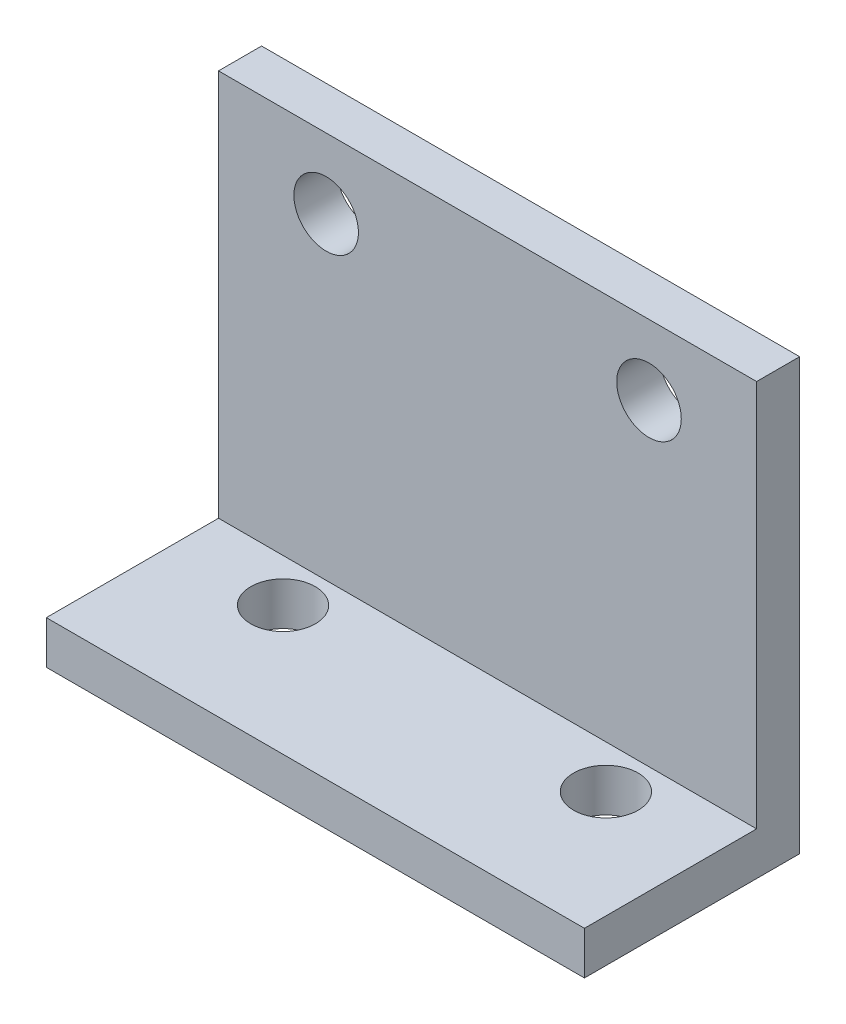
ISO-10303-21;
HEADER;
FILE_DESCRIPTION(('STEP AP214'),'2;1');
FILE_NAME('part.step','',(''),(''),'','','');
FILE_SCHEMA(('AUTOMOTIVE_DESIGN { 1 0 10303 214 1 1 1 1 }'));
ENDSEC;
DATA;
#1=APPLICATION_CONTEXT('core data for automotive mechanical design processes');
#2=APPLICATION_PROTOCOL_DEFINITION('international standard','automotive_design',2000,#1);
#3=PRODUCT_CONTEXT('',#1,'mechanical');
#4=PRODUCT('Part','Part','',(#3));
#5=PRODUCT_RELATED_PRODUCT_CATEGORY('part','',(#4));
#6=PRODUCT_DEFINITION_FORMATION('','',#4);
#7=PRODUCT_DEFINITION_CONTEXT('part definition',#1,'design');
#8=PRODUCT_DEFINITION('design','',#6,#7);
#9=PRODUCT_DEFINITION_SHAPE('','',#8);
#10=(LENGTH_UNIT() NAMED_UNIT(*) SI_UNIT(.MILLI.,.METRE.));
#11=(NAMED_UNIT(*) PLANE_ANGLE_UNIT() SI_UNIT($,.RADIAN.));
#12=(NAMED_UNIT(*) SI_UNIT($,.STERADIAN.) SOLID_ANGLE_UNIT());
#13=UNCERTAINTY_MEASURE_WITH_UNIT(LENGTH_MEASURE(1.E-05),#10,'distance_accuracy_value','');
#14=(GEOMETRIC_REPRESENTATION_CONTEXT(3) GLOBAL_UNCERTAINTY_ASSIGNED_CONTEXT((#13)) GLOBAL_UNIT_ASSIGNED_CONTEXT((#10,
#11,#12)) REPRESENTATION_CONTEXT('',''));
#15=CARTESIAN_POINT('',(0.,0.,0.));
#16=DIRECTION('',(0.,0.,1.));
#17=DIRECTION('',(1.,0.,0.));
#18=AXIS2_PLACEMENT_3D('',#15,#16,#17);
#19=CARTESIAN_POINT('',(-12.5,20.,0.));
#20=DIRECTION('',(1.,0.,0.));
#21=DIRECTION('',(0.,0.,-1.));
#22=AXIS2_PLACEMENT_3D('',#19,#20,#21);
#23=PLANE('',#22);
#24=DIRECTION('',(0.,0.,1.));
#25=VECTOR('',#24,1.);
#26=CARTESIAN_POINT('',(-12.5,0.,0.));
#27=LINE('',#26,#25);
#28=CARTESIAN_POINT('',(-12.5,0.,-5.));
#29=VERTEX_POINT('',#28);
#30=CARTESIAN_POINT('',(-12.5,0.,5.));
#31=VERTEX_POINT('',#30);
#32=EDGE_CURVE('E114',#29,#31,#27,.T.);
#33=ORIENTED_EDGE('',*,*,#32,.T.);
#34=DIRECTION('',(0.,-1.,0.));
#35=VECTOR('',#34,1.);
#36=CARTESIAN_POINT('',(-12.5,2.,5.));
#37=LINE('',#36,#35);
#38=CARTESIAN_POINT('',(-12.5,2.,5.));
#39=VERTEX_POINT('',#38);
#40=EDGE_CURVE('E115',#39,#31,#37,.T.);
#41=ORIENTED_EDGE('',*,*,#40,.F.);
#42=DIRECTION('',(0.,0.,1.));
#43=VECTOR('',#42,1.);
#44=CARTESIAN_POINT('',(-12.5,2.,0.));
#45=LINE('',#44,#43);
#46=CARTESIAN_POINT('',(-12.5,2.,-3.));
#47=VERTEX_POINT('',#46);
#48=EDGE_CURVE('E100',#47,#39,#45,.T.);
#49=ORIENTED_EDGE('',*,*,#48,.F.);
#50=DIRECTION('',(0.,-1.,0.));
#51=VECTOR('',#50,1.);
#52=CARTESIAN_POINT('',(-12.5,20.,-3.));
#53=LINE('',#52,#51);
#54=CARTESIAN_POINT('',(-12.5,20.,-3.));
#55=VERTEX_POINT('',#54);
#56=EDGE_CURVE('E11',#55,#47,#53,.T.);
#57=ORIENTED_EDGE('',*,*,#56,.F.);
#58=DIRECTION('',(0.,0.,1.));
#59=VECTOR('',#58,1.);
#60=CARTESIAN_POINT('',(-12.5,20.,0.));
#61=LINE('',#60,#59);
#62=CARTESIAN_POINT('',(-12.5,20.,-5.));
#63=VERTEX_POINT('',#62);
#64=EDGE_CURVE('E136',#63,#55,#61,.T.);
#65=ORIENTED_EDGE('',*,*,#64,.F.);
#66=DIRECTION('',(0.,-1.,0.));
#67=VECTOR('',#66,1.);
#68=CARTESIAN_POINT('',(-12.5,20.,-5.));
#69=LINE('',#68,#67);
#70=EDGE_CURVE('E62',#63,#29,#69,.T.);
#71=ORIENTED_EDGE('',*,*,#70,.T.);
#72=EDGE_LOOP('',(#33,#41,#49,#57,#65,#71));
#73=FACE_BOUND('',#72,.T.);
#74=ADVANCED_FACE('F39',(#73),#23,.F.);
#75=CARTESIAN_POINT('',(0.,20.,-3.));
#76=DIRECTION('',(0.,0.,-1.));
#77=DIRECTION('',(-1.,0.,0.));
#78=AXIS2_PLACEMENT_3D('',#75,#76,#77);
#79=PLANE('',#78);
#80=CARTESIAN_POINT('',(-7.5,16.7456118249769,-3.));
#81=DIRECTION('',(0.,0.,1.));
#82=DIRECTION('',(1.,0.,0.));
#83=AXIS2_PLACEMENT_3D('',#80,#81,#82);
#84=CIRCLE('',#83,1.5);
#85=CARTESIAN_POINT('',(-6.,16.7456118249769,-3.));
#86=VERTEX_POINT('',#85);
#87=EDGE_CURVE('E204',#86,#86,#84,.T.);
#88=ORIENTED_EDGE('',*,*,#87,.F.);
#89=EDGE_LOOP('',(#88));
#90=FACE_BOUND('',#89,.T.);
#91=CARTESIAN_POINT('',(7.5,16.7456118249769,-3.));
#92=DIRECTION('',(0.,0.,1.));
#93=DIRECTION('',(1.,0.,0.));
#94=AXIS2_PLACEMENT_3D('',#91,#92,#93);
#95=CIRCLE('',#94,1.5);
#96=CARTESIAN_POINT('',(9.,16.7456118249769,-3.));
#97=VERTEX_POINT('',#96);
#98=EDGE_CURVE('E209',#97,#97,#95,.T.);
#99=ORIENTED_EDGE('',*,*,#98,.F.);
#100=EDGE_LOOP('',(#99));
#101=FACE_BOUND('',#100,.T.);
#102=ORIENTED_EDGE('',*,*,#56,.T.);
#103=DIRECTION('',(1.,0.,0.));
#104=VECTOR('',#103,1.);
#105=CARTESIAN_POINT('',(0.,2.,-3.));
#106=LINE('',#105,#104);
#107=CARTESIAN_POINT('',(12.5,2.,-3.));
#108=VERTEX_POINT('',#107);
#109=EDGE_CURVE('E120',#47,#108,#106,.T.);
#110=ORIENTED_EDGE('',*,*,#109,.T.);
#111=DIRECTION('',(0.,-1.,0.));
#112=VECTOR('',#111,1.);
#113=CARTESIAN_POINT('',(12.5,20.,-3.));
#114=LINE('',#113,#112);
#115=CARTESIAN_POINT('',(12.5,20.,-3.));
#116=VERTEX_POINT('',#115);
#117=EDGE_CURVE('E46',#116,#108,#114,.T.);
#118=ORIENTED_EDGE('',*,*,#117,.F.);
#119=DIRECTION('',(1.,0.,0.));
#120=VECTOR('',#119,1.);
#121=CARTESIAN_POINT('',(0.,20.,-3.));
#122=LINE('',#121,#120);
#123=EDGE_CURVE('E82',#55,#116,#122,.T.);
#124=ORIENTED_EDGE('',*,*,#123,.F.);
#125=EDGE_LOOP('',(#102,#110,#118,#124));
#126=FACE_BOUND('',#125,.T.);
#127=ADVANCED_FACE('F158',(#90,#101,#126),#79,.F.);
#128=CARTESIAN_POINT('',(12.5,20.,0.));
#129=DIRECTION('',(1.,0.,0.));
#130=DIRECTION('',(0.,0.,-1.));
#131=AXIS2_PLACEMENT_3D('',#128,#129,#130);
#132=PLANE('',#131);
#133=DIRECTION('',(0.,0.,1.));
#134=VECTOR('',#133,1.);
#135=CARTESIAN_POINT('',(12.5,0.,0.));
#136=LINE('',#135,#134);
#137=CARTESIAN_POINT('',(12.5,0.,-5.));
#138=VERTEX_POINT('',#137);
#139=CARTESIAN_POINT('',(12.5,0.,5.));
#140=VERTEX_POINT('',#139);
#141=EDGE_CURVE('E145',#138,#140,#136,.T.);
#142=ORIENTED_EDGE('',*,*,#141,.F.);
#143=DIRECTION('',(0.,-1.,0.));
#144=VECTOR('',#143,1.);
#145=CARTESIAN_POINT('',(12.5,20.,-5.));
#146=LINE('',#145,#144);
#147=CARTESIAN_POINT('',(12.5,20.,-5.));
#148=VERTEX_POINT('',#147);
#149=EDGE_CURVE('E150',#148,#138,#146,.T.);
#150=ORIENTED_EDGE('',*,*,#149,.F.);
#151=DIRECTION('',(0.,0.,1.));
#152=VECTOR('',#151,1.);
#153=CARTESIAN_POINT('',(12.5,20.,0.));
#154=LINE('',#153,#152);
#155=EDGE_CURVE('E140',#148,#116,#154,.T.);
#156=ORIENTED_EDGE('',*,*,#155,.T.);
#157=ORIENTED_EDGE('',*,*,#117,.T.);
#158=DIRECTION('',(0.,0.,1.));
#159=VECTOR('',#158,1.);
#160=CARTESIAN_POINT('',(12.5,2.,0.));
#161=LINE('',#160,#159);
#162=CARTESIAN_POINT('',(12.5,2.,5.));
#163=VERTEX_POINT('',#162);
#164=EDGE_CURVE('E53',#108,#163,#161,.T.);
#165=ORIENTED_EDGE('',*,*,#164,.T.);
#166=DIRECTION('',(0.,-1.,0.));
#167=VECTOR('',#166,1.);
#168=CARTESIAN_POINT('',(12.5,2.,5.));
#169=LINE('',#168,#167);
#170=EDGE_CURVE('E108',#163,#140,#169,.T.);
#171=ORIENTED_EDGE('',*,*,#170,.T.);
#172=EDGE_LOOP('',(#142,#150,#156,#157,#165,#171));
#173=FACE_BOUND('',#172,.T.);
#174=ADVANCED_FACE('F118',(#173),#132,.T.);
#175=CARTESIAN_POINT('',(0.,20.,-5.));
#176=DIRECTION('',(0.,0.,-1.));
#177=DIRECTION('',(-1.,0.,0.));
#178=AXIS2_PLACEMENT_3D('',#175,#176,#177);
#179=PLANE('',#178);
#180=CARTESIAN_POINT('',(-7.5,16.7456118249769,-5.));
#181=DIRECTION('',(0.,0.,1.));
#182=DIRECTION('',(1.,0.,0.));
#183=AXIS2_PLACEMENT_3D('',#180,#181,#182);
#184=CIRCLE('',#183,1.5);
#185=CARTESIAN_POINT('',(-6.,16.7456118249769,-5.));
#186=VERTEX_POINT('',#185);
#187=EDGE_CURVE('E130',#186,#186,#184,.T.);
#188=ORIENTED_EDGE('',*,*,#187,.T.);
#189=EDGE_LOOP('',(#188));
#190=FACE_BOUND('',#189,.T.);
#191=CARTESIAN_POINT('',(7.5,16.7456118249769,-5.));
#192=DIRECTION('',(0.,0.,1.));
#193=DIRECTION('',(1.,0.,0.));
#194=AXIS2_PLACEMENT_3D('',#191,#192,#193);
#195=CIRCLE('',#194,1.5);
#196=CARTESIAN_POINT('',(9.,16.7456118249769,-5.));
#197=VERTEX_POINT('',#196);
#198=EDGE_CURVE('E205',#197,#197,#195,.T.);
#199=ORIENTED_EDGE('',*,*,#198,.T.);
#200=EDGE_LOOP('',(#199));
#201=FACE_BOUND('',#200,.T.);
#202=DIRECTION('',(1.,0.,0.));
#203=VECTOR('',#202,1.);
#204=CARTESIAN_POINT('',(0.,0.,-5.));
#205=LINE('',#204,#203);
#206=EDGE_CURVE('E138',#29,#138,#205,.T.);
#207=ORIENTED_EDGE('',*,*,#206,.F.);
#208=ORIENTED_EDGE('',*,*,#70,.F.);
#209=DIRECTION('',(1.,0.,0.));
#210=VECTOR('',#209,1.);
#211=CARTESIAN_POINT('',(0.,20.,-5.));
#212=LINE('',#211,#210);
#213=EDGE_CURVE('E142',#63,#148,#212,.T.);
#214=ORIENTED_EDGE('',*,*,#213,.T.);
#215=ORIENTED_EDGE('',*,*,#149,.T.);
#216=EDGE_LOOP('',(#207,#208,#214,#215));
#217=FACE_BOUND('',#216,.T.);
#218=ADVANCED_FACE('F151',(#190,#201,#217),#179,.T.);
#219=CARTESIAN_POINT('',(0.,20.,0.));
#220=DIRECTION('',(0.,1.,0.));
#221=DIRECTION('',(0.,0.,1.));
#222=AXIS2_PLACEMENT_3D('',#219,#220,#221);
#223=PLANE('',#222);
#224=ORIENTED_EDGE('',*,*,#64,.T.);
#225=ORIENTED_EDGE('',*,*,#123,.T.);
#226=ORIENTED_EDGE('',*,*,#155,.F.);
#227=ORIENTED_EDGE('',*,*,#213,.F.);
#228=EDGE_LOOP('',(#224,#225,#226,#227));
#229=FACE_BOUND('',#228,.T.);
#230=ADVANCED_FACE('F171',(#229),#223,.T.);
#231=CARTESIAN_POINT('',(0.,0.,0.));
#232=DIRECTION('',(0.,1.,0.));
#233=DIRECTION('',(0.,0.,1.));
#234=AXIS2_PLACEMENT_3D('',#231,#232,#233);
#235=PLANE('',#234);
#236=ORIENTED_EDGE('',*,*,#32,.F.);
#237=ORIENTED_EDGE('',*,*,#206,.T.);
#238=ORIENTED_EDGE('',*,*,#141,.T.);
#239=DIRECTION('',(1.,0.,0.));
#240=VECTOR('',#239,1.);
#241=CARTESIAN_POINT('',(0.,0.,5.));
#242=LINE('',#241,#240);
#243=EDGE_CURVE('E111',#31,#140,#242,.T.);
#244=ORIENTED_EDGE('',*,*,#243,.F.);
#245=EDGE_LOOP('',(#236,#237,#238,#244));
#246=FACE_BOUND('',#245,.T.);
#247=CARTESIAN_POINT('',(7.5,0.,-0.997487312622686));
#248=DIRECTION('',(0.,1.,0.));
#249=DIRECTION('',(0.,0.,1.));
#250=AXIS2_PLACEMENT_3D('',#247,#248,#249);
#251=CIRCLE('',#250,1.5);
#252=CARTESIAN_POINT('',(7.5,0.,0.502512687377314));
#253=VERTEX_POINT('',#252);
#254=EDGE_CURVE('E126',#253,#253,#251,.T.);
#255=ORIENTED_EDGE('',*,*,#254,.T.);
#256=EDGE_LOOP('',(#255));
#257=FACE_BOUND('',#256,.T.);
#258=CARTESIAN_POINT('',(-7.50000000000001,0.,-0.997487312622686));
#259=DIRECTION('',(0.,1.,0.));
#260=DIRECTION('',(0.,0.,1.));
#261=AXIS2_PLACEMENT_3D('',#258,#259,#260);
#262=CIRCLE('',#261,1.5);
#263=CARTESIAN_POINT('',(-7.50000000000001,0.,0.502512687377314));
#264=VERTEX_POINT('',#263);
#265=EDGE_CURVE('E129',#264,#264,#262,.T.);
#266=ORIENTED_EDGE('',*,*,#265,.T.);
#267=EDGE_LOOP('',(#266));
#268=FACE_BOUND('',#267,.T.);
#269=ADVANCED_FACE('F155',(#246,#257,#268),#235,.F.);
#270=CARTESIAN_POINT('',(0.,2.,5.));
#271=DIRECTION('',(0.,0.,-1.));
#272=DIRECTION('',(-1.,0.,0.));
#273=AXIS2_PLACEMENT_3D('',#270,#271,#272);
#274=PLANE('',#273);
#275=ORIENTED_EDGE('',*,*,#243,.T.);
#276=ORIENTED_EDGE('',*,*,#170,.F.);
#277=DIRECTION('',(1.,0.,0.));
#278=VECTOR('',#277,1.);
#279=CARTESIAN_POINT('',(0.,2.,5.));
#280=LINE('',#279,#278);
#281=EDGE_CURVE('E97',#39,#163,#280,.T.);
#282=ORIENTED_EDGE('',*,*,#281,.F.);
#283=ORIENTED_EDGE('',*,*,#40,.T.);
#284=EDGE_LOOP('',(#275,#276,#282,#283));
#285=FACE_BOUND('',#284,.T.);
#286=ADVANCED_FACE('F109',(#285),#274,.F.);
#287=CARTESIAN_POINT('',(-7.50000000000001,2.,-0.997487312622686));
#288=DIRECTION('',(0.,-1.,0.));
#289=DIRECTION('',(0.,0.,-1.));
#290=AXIS2_PLACEMENT_3D('',#287,#288,#289);
#291=CYLINDRICAL_SURFACE('',#290,1.5);
#292=CARTESIAN_POINT('',(-7.50000000000001,2.,-0.997487312622686));
#293=DIRECTION('',(0.,1.,0.));
#294=DIRECTION('',(0.,0.,1.));
#295=AXIS2_PLACEMENT_3D('',#292,#293,#294);
#296=CIRCLE('',#295,1.5);
#297=CARTESIAN_POINT('',(-7.50000000000001,2.,0.502512687377314));
#298=VERTEX_POINT('',#297);
#299=EDGE_CURVE('E104',#298,#298,#296,.T.);
#300=ORIENTED_EDGE('',*,*,#299,.T.);
#301=EDGE_LOOP('',(#300));
#302=FACE_BOUND('',#301,.T.);
#303=ORIENTED_EDGE('',*,*,#265,.F.);
#304=EDGE_LOOP('',(#303));
#305=FACE_BOUND('',#304,.T.);
#306=ADVANCED_FACE('F181',(#302,#305),#291,.F.);
#307=CARTESIAN_POINT('',(7.5,2.,-0.997487312622686));
#308=DIRECTION('',(0.,-1.,0.));
#309=DIRECTION('',(0.,0.,-1.));
#310=AXIS2_PLACEMENT_3D('',#307,#308,#309);
#311=CYLINDRICAL_SURFACE('',#310,1.5);
#312=CARTESIAN_POINT('',(7.5,2.,-0.997487312622686));
#313=DIRECTION('',(0.,1.,0.));
#314=DIRECTION('',(0.,0.,1.));
#315=AXIS2_PLACEMENT_3D('',#312,#313,#314);
#316=CIRCLE('',#315,1.5);
#317=CARTESIAN_POINT('',(7.5,2.,0.502512687377314));
#318=VERTEX_POINT('',#317);
#319=EDGE_CURVE('E134',#318,#318,#316,.T.);
#320=ORIENTED_EDGE('',*,*,#319,.T.);
#321=EDGE_LOOP('',(#320));
#322=FACE_BOUND('',#321,.T.);
#323=ORIENTED_EDGE('',*,*,#254,.F.);
#324=EDGE_LOOP('',(#323));
#325=FACE_BOUND('',#324,.T.);
#326=ADVANCED_FACE('F178',(#322,#325),#311,.F.);
#327=CARTESIAN_POINT('',(0.,2.,0.));
#328=DIRECTION('',(0.,1.,0.));
#329=DIRECTION('',(0.,0.,1.));
#330=AXIS2_PLACEMENT_3D('',#327,#328,#329);
#331=PLANE('',#330);
#332=ORIENTED_EDGE('',*,*,#319,.F.);
#333=EDGE_LOOP('',(#332));
#334=FACE_BOUND('',#333,.T.);
#335=ORIENTED_EDGE('',*,*,#299,.F.);
#336=EDGE_LOOP('',(#335));
#337=FACE_BOUND('',#336,.T.);
#338=ORIENTED_EDGE('',*,*,#281,.T.);
#339=ORIENTED_EDGE('',*,*,#164,.F.);
#340=ORIENTED_EDGE('',*,*,#109,.F.);
#341=ORIENTED_EDGE('',*,*,#48,.T.);
#342=EDGE_LOOP('',(#338,#339,#340,#341));
#343=FACE_BOUND('',#342,.T.);
#344=ADVANCED_FACE('F99',(#334,#337,#343),#331,.T.);
#345=CARTESIAN_POINT('',(7.5,16.7456118249769,-5.));
#346=DIRECTION('',(0.,0.,1.));
#347=DIRECTION('',(1.,0.,0.));
#348=AXIS2_PLACEMENT_3D('',#345,#346,#347);
#349=CYLINDRICAL_SURFACE('',#348,1.5);
#350=ORIENTED_EDGE('',*,*,#198,.F.);
#351=EDGE_LOOP('',(#350));
#352=FACE_BOUND('',#351,.T.);
#353=ORIENTED_EDGE('',*,*,#98,.T.);
#354=EDGE_LOOP('',(#353));
#355=FACE_BOUND('',#354,.T.);
#356=ADVANCED_FACE('F190',(#352,#355),#349,.F.);
#357=CARTESIAN_POINT('',(-7.5,16.7456118249769,-5.));
#358=DIRECTION('',(0.,0.,1.));
#359=DIRECTION('',(1.,0.,0.));
#360=AXIS2_PLACEMENT_3D('',#357,#358,#359);
#361=CYLINDRICAL_SURFACE('',#360,1.5);
#362=ORIENTED_EDGE('',*,*,#187,.F.);
#363=EDGE_LOOP('',(#362));
#364=FACE_BOUND('',#363,.T.);
#365=ORIENTED_EDGE('',*,*,#87,.T.);
#366=EDGE_LOOP('',(#365));
#367=FACE_BOUND('',#366,.T.);
#368=ADVANCED_FACE('F194',(#364,#367),#361,.F.);
#369=CLOSED_SHELL('',(#74,#127,#174,#218,#230,#269,#286,#306,#326,#344,#356,#368));
#370=MANIFOLD_SOLID_BREP('B2',#369);
#371=ADVANCED_BREP_SHAPE_REPRESENTATION('',(#18,#370),#14);
#372=SHAPE_DEFINITION_REPRESENTATION(#9,#371);
ENDSEC;
END-ISO-10303-21;
